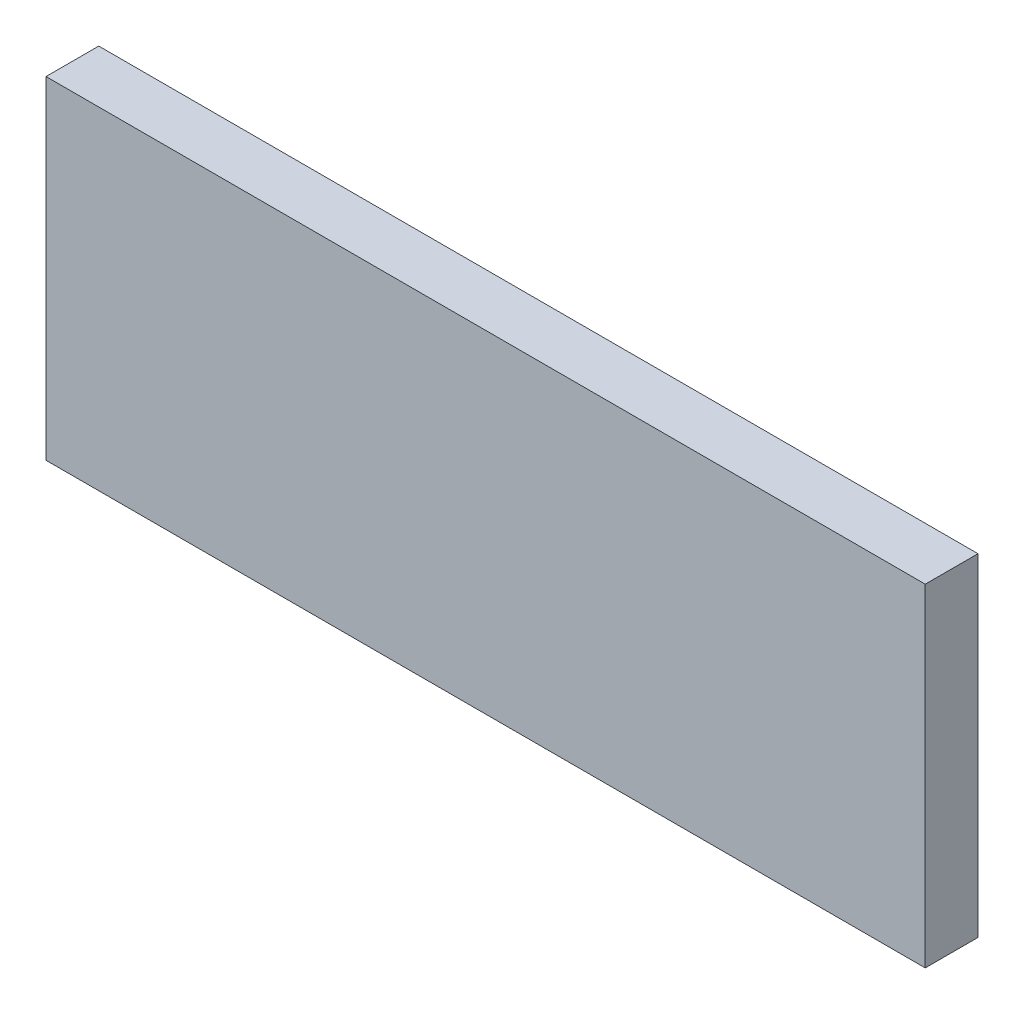
ISO-10303-21;
HEADER;
FILE_DESCRIPTION(('STEP AP214'),'2;1');
FILE_NAME('part.step','',(''),(''),'','','');
FILE_SCHEMA(('AUTOMOTIVE_DESIGN { 1 0 10303 214 1 1 1 1 }'));
ENDSEC;
DATA;
#1=APPLICATION_CONTEXT('core data for automotive mechanical design processes');
#2=APPLICATION_PROTOCOL_DEFINITION('international standard','automotive_design',2000,#1);
#3=PRODUCT_CONTEXT('',#1,'mechanical');
#4=PRODUCT('Part','Part','',(#3));
#5=PRODUCT_RELATED_PRODUCT_CATEGORY('part','',(#4));
#6=PRODUCT_DEFINITION_FORMATION('','',#4);
#7=PRODUCT_DEFINITION_CONTEXT('part definition',#1,'design');
#8=PRODUCT_DEFINITION('design','',#6,#7);
#9=PRODUCT_DEFINITION_SHAPE('','',#8);
#10=(LENGTH_UNIT() NAMED_UNIT(*) SI_UNIT(.MILLI.,.METRE.));
#11=(NAMED_UNIT(*) PLANE_ANGLE_UNIT() SI_UNIT($,.RADIAN.));
#12=(NAMED_UNIT(*) SI_UNIT($,.STERADIAN.) SOLID_ANGLE_UNIT());
#13=UNCERTAINTY_MEASURE_WITH_UNIT(LENGTH_MEASURE(1.E-05),#10,'distance_accuracy_value','');
#14=(GEOMETRIC_REPRESENTATION_CONTEXT(3) GLOBAL_UNCERTAINTY_ASSIGNED_CONTEXT((#13)) GLOBAL_UNIT_ASSIGNED_CONTEXT((#10,
#11,#12)) REPRESENTATION_CONTEXT('',''));
#15=CARTESIAN_POINT('',(0.,0.,0.));
#16=DIRECTION('',(0.,0.,1.));
#17=DIRECTION('',(1.,0.,0.));
#18=AXIS2_PLACEMENT_3D('',#15,#16,#17);
#19=CARTESIAN_POINT('',(25.,9.45,3.));
#20=DIRECTION('',(-1.,0.,0.));
#21=DIRECTION('',(0.,-1.,0.));
#22=AXIS2_PLACEMENT_3D('',#19,#20,#21);
#23=PLANE('',#22);
#24=DIRECTION('',(0.,1.,0.));
#25=VECTOR('',#24,1.);
#26=CARTESIAN_POINT('',(25.,9.45,0.));
#27=LINE('',#26,#25);
#28=CARTESIAN_POINT('',(25.,-9.45,0.));
#29=VERTEX_POINT('',#28);
#30=CARTESIAN_POINT('',(25.,9.45,0.));
#31=VERTEX_POINT('',#30);
#32=EDGE_CURVE('E102',#29,#31,#27,.T.);
#33=ORIENTED_EDGE('',*,*,#32,.T.);
#34=DIRECTION('',(0.,0.,-1.));
#35=VECTOR('',#34,1.);
#36=CARTESIAN_POINT('',(25.,9.45,3.));
#37=LINE('',#36,#35);
#38=CARTESIAN_POINT('',(25.,9.45,3.));
#39=VERTEX_POINT('',#38);
#40=EDGE_CURVE('E11',#39,#31,#37,.T.);
#41=ORIENTED_EDGE('',*,*,#40,.F.);
#42=DIRECTION('',(0.,1.,0.));
#43=VECTOR('',#42,1.);
#44=CARTESIAN_POINT('',(25.,9.45,3.));
#45=LINE('',#44,#43);
#46=CARTESIAN_POINT('',(25.,-9.45,3.));
#47=VERTEX_POINT('',#46);
#48=EDGE_CURVE('E90',#47,#39,#45,.T.);
#49=ORIENTED_EDGE('',*,*,#48,.F.);
#50=DIRECTION('',(0.,0.,-1.));
#51=VECTOR('',#50,1.);
#52=CARTESIAN_POINT('',(25.,-9.45,3.));
#53=LINE('',#52,#51);
#54=EDGE_CURVE('E98',#47,#29,#53,.T.);
#55=ORIENTED_EDGE('',*,*,#54,.T.);
#56=EDGE_LOOP('',(#33,#41,#49,#55));
#57=FACE_BOUND('',#56,.T.);
#58=ADVANCED_FACE('F39',(#57),#23,.F.);
#59=CARTESIAN_POINT('',(-25.,9.45,3.));
#60=DIRECTION('',(0.,-1.,0.));
#61=DIRECTION('',(1.,0.,0.));
#62=AXIS2_PLACEMENT_3D('',#59,#60,#61);
#63=PLANE('',#62);
#64=DIRECTION('',(-1.,0.,0.));
#65=VECTOR('',#64,1.);
#66=CARTESIAN_POINT('',(-25.,9.45,0.));
#67=LINE('',#66,#65);
#68=CARTESIAN_POINT('',(-25.,9.45,0.));
#69=VERTEX_POINT('',#68);
#70=EDGE_CURVE('E94',#31,#69,#67,.T.);
#71=ORIENTED_EDGE('',*,*,#70,.T.);
#72=DIRECTION('',(0.,0.,-1.));
#73=VECTOR('',#72,1.);
#74=CARTESIAN_POINT('',(-25.,9.45,3.));
#75=LINE('',#74,#73);
#76=CARTESIAN_POINT('',(-25.,9.45,3.));
#77=VERTEX_POINT('',#76);
#78=EDGE_CURVE('E47',#77,#69,#75,.T.);
#79=ORIENTED_EDGE('',*,*,#78,.F.);
#80=DIRECTION('',(-1.,0.,0.));
#81=VECTOR('',#80,1.);
#82=CARTESIAN_POINT('',(-25.,9.45,3.));
#83=LINE('',#82,#81);
#84=EDGE_CURVE('E85',#39,#77,#83,.T.);
#85=ORIENTED_EDGE('',*,*,#84,.F.);
#86=ORIENTED_EDGE('',*,*,#40,.T.);
#87=EDGE_LOOP('',(#71,#79,#85,#86));
#88=FACE_BOUND('',#87,.T.);
#89=ADVANCED_FACE('F93',(#88),#63,.F.);
#90=CARTESIAN_POINT('',(-25.,9.45,3.));
#91=DIRECTION('',(1.,0.,0.));
#92=DIRECTION('',(0.,0.,-1.));
#93=AXIS2_PLACEMENT_3D('',#90,#91,#92);
#94=PLANE('',#93);
#95=DIRECTION('',(0.,-1.,0.));
#96=VECTOR('',#95,1.);
#97=CARTESIAN_POINT('',(-25.,9.45,0.));
#98=LINE('',#97,#96);
#99=CARTESIAN_POINT('',(-25.,-9.45,0.));
#100=VERTEX_POINT('',#99);
#101=EDGE_CURVE('E72',#69,#100,#98,.T.);
#102=ORIENTED_EDGE('',*,*,#101,.T.);
#103=DIRECTION('',(0.,0.,-1.));
#104=VECTOR('',#103,1.);
#105=CARTESIAN_POINT('',(-25.,-9.45,3.));
#106=LINE('',#105,#104);
#107=CARTESIAN_POINT('',(-25.,-9.45,3.));
#108=VERTEX_POINT('',#107);
#109=EDGE_CURVE('E95',#108,#100,#106,.T.);
#110=ORIENTED_EDGE('',*,*,#109,.F.);
#111=DIRECTION('',(0.,-1.,0.));
#112=VECTOR('',#111,1.);
#113=CARTESIAN_POINT('',(-25.,9.45,3.));
#114=LINE('',#113,#112);
#115=EDGE_CURVE('E88',#77,#108,#114,.T.);
#116=ORIENTED_EDGE('',*,*,#115,.F.);
#117=ORIENTED_EDGE('',*,*,#78,.T.);
#118=EDGE_LOOP('',(#102,#110,#116,#117));
#119=FACE_BOUND('',#118,.T.);
#120=ADVANCED_FACE('F96',(#119),#94,.F.);
#121=CARTESIAN_POINT('',(-25.,-9.45,3.));
#122=DIRECTION('',(0.,1.,0.));
#123=DIRECTION('',(0.,0.,1.));
#124=AXIS2_PLACEMENT_3D('',#121,#122,#123);
#125=PLANE('',#124);
#126=DIRECTION('',(1.,0.,0.));
#127=VECTOR('',#126,1.);
#128=CARTESIAN_POINT('',(-25.,-9.45,0.));
#129=LINE('',#128,#127);
#130=EDGE_CURVE('E78',#100,#29,#129,.T.);
#131=ORIENTED_EDGE('',*,*,#130,.T.);
#132=ORIENTED_EDGE('',*,*,#54,.F.);
#133=DIRECTION('',(1.,0.,0.));
#134=VECTOR('',#133,1.);
#135=CARTESIAN_POINT('',(-25.,-9.45,3.));
#136=LINE('',#135,#134);
#137=EDGE_CURVE('E55',#108,#47,#136,.T.);
#138=ORIENTED_EDGE('',*,*,#137,.F.);
#139=ORIENTED_EDGE('',*,*,#109,.T.);
#140=EDGE_LOOP('',(#131,#132,#138,#139));
#141=FACE_BOUND('',#140,.T.);
#142=ADVANCED_FACE('F109',(#141),#125,.F.);
#143=CARTESIAN_POINT('',(0.,0.,3.));
#144=DIRECTION('',(0.,0.,1.));
#145=DIRECTION('',(1.,0.,0.));
#146=AXIS2_PLACEMENT_3D('',#143,#144,#145);
#147=PLANE('',#146);
#148=ORIENTED_EDGE('',*,*,#48,.T.);
#149=ORIENTED_EDGE('',*,*,#84,.T.);
#150=ORIENTED_EDGE('',*,*,#115,.T.);
#151=ORIENTED_EDGE('',*,*,#137,.T.);
#152=EDGE_LOOP('',(#148,#149,#150,#151));
#153=FACE_BOUND('',#152,.T.);
#154=ADVANCED_FACE('F86',(#153),#147,.T.);
#155=CARTESIAN_POINT('',(0.,0.,0.));
#156=DIRECTION('',(0.,0.,1.));
#157=DIRECTION('',(1.,0.,0.));
#158=AXIS2_PLACEMENT_3D('',#155,#156,#157);
#159=PLANE('',#158);
#160=ORIENTED_EDGE('',*,*,#32,.F.);
#161=ORIENTED_EDGE('',*,*,#130,.F.);
#162=ORIENTED_EDGE('',*,*,#101,.F.);
#163=ORIENTED_EDGE('',*,*,#70,.F.);
#164=EDGE_LOOP('',(#160,#161,#162,#163));
#165=FACE_BOUND('',#164,.T.);
#166=ADVANCED_FACE('F112',(#165),#159,.F.);
#167=CLOSED_SHELL('',(#58,#89,#120,#142,#154,#166));
#168=MANIFOLD_SOLID_BREP('B2',#167);
#169=ADVANCED_BREP_SHAPE_REPRESENTATION('',(#18,#168),#14);
#170=SHAPE_DEFINITION_REPRESENTATION(#9,#169);
ENDSEC;
END-ISO-10303-21;
